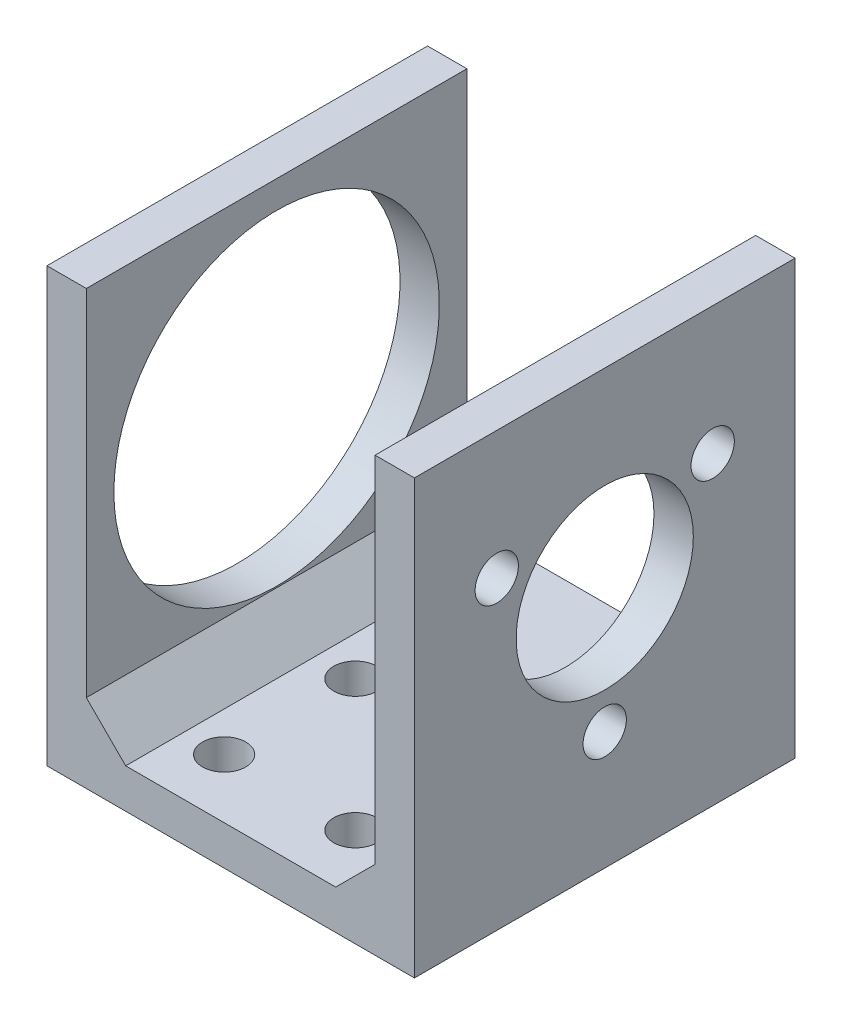
ISO-10303-21;
HEADER;
FILE_DESCRIPTION(('STEP AP214'),'2;1');
FILE_NAME('part.step','',(''),(''),'','','');
FILE_SCHEMA(('AUTOMOTIVE_DESIGN { 1 0 10303 214 1 1 1 1 }'));
ENDSEC;
DATA;
#1=APPLICATION_CONTEXT('core data for automotive mechanical design processes');
#2=APPLICATION_PROTOCOL_DEFINITION('international standard','automotive_design',2000,#1);
#3=PRODUCT_CONTEXT('',#1,'mechanical');
#4=PRODUCT('Part','Part','',(#3));
#5=PRODUCT_RELATED_PRODUCT_CATEGORY('part','',(#4));
#6=PRODUCT_DEFINITION_FORMATION('','',#4);
#7=PRODUCT_DEFINITION_CONTEXT('part definition',#1,'design');
#8=PRODUCT_DEFINITION('design','',#6,#7);
#9=PRODUCT_DEFINITION_SHAPE('','',#8);
#10=(LENGTH_UNIT() NAMED_UNIT(*) SI_UNIT(.MILLI.,.METRE.));
#11=(NAMED_UNIT(*) PLANE_ANGLE_UNIT() SI_UNIT($,.RADIAN.));
#12=(NAMED_UNIT(*) SI_UNIT($,.STERADIAN.) SOLID_ANGLE_UNIT());
#13=UNCERTAINTY_MEASURE_WITH_UNIT(LENGTH_MEASURE(1.E-05),#10,'distance_accuracy_value','');
#14=(GEOMETRIC_REPRESENTATION_CONTEXT(3) GLOBAL_UNCERTAINTY_ASSIGNED_CONTEXT((#13)) GLOBAL_UNIT_ASSIGNED_CONTEXT((#10,
#11,#12)) REPRESENTATION_CONTEXT('',''));
#15=CARTESIAN_POINT('',(0.,0.,0.));
#16=DIRECTION('',(0.,0.,1.));
#17=DIRECTION('',(1.,0.,0.));
#18=AXIS2_PLACEMENT_3D('',#15,#16,#17);
#19=CARTESIAN_POINT('',(0.,3.,0.));
#20=DIRECTION('',(0.,-1.,0.));
#21=DIRECTION('',(0.,0.,-1.));
#22=AXIS2_PLACEMENT_3D('',#19,#20,#21);
#23=PLANE('',#22);
#24=CARTESIAN_POINT('',(5.,3.,0.));
#25=DIRECTION('',(0.,1.,0.));
#26=DIRECTION('',(0.,0.,1.));
#27=AXIS2_PLACEMENT_3D('',#24,#25,#26);
#28=CIRCLE('',#27,1.65);
#29=CARTESIAN_POINT('',(5.,3.,1.65));
#30=VERTEX_POINT('',#29);
#31=EDGE_CURVE('E517',#30,#30,#28,.T.);
#32=ORIENTED_EDGE('',*,*,#31,.F.);
#33=EDGE_LOOP('',(#32));
#34=FACE_BOUND('',#33,.T.);
#35=CARTESIAN_POINT('',(-5.,3.,10.));
#36=DIRECTION('',(0.,1.,0.));
#37=DIRECTION('',(0.,0.,1.));
#38=AXIS2_PLACEMENT_3D('',#35,#36,#37);
#39=CIRCLE('',#38,1.65);
#40=CARTESIAN_POINT('',(-5.,3.,11.65));
#41=VERTEX_POINT('',#40);
#42=EDGE_CURVE('E521',#41,#41,#39,.T.);
#43=ORIENTED_EDGE('',*,*,#42,.F.);
#44=EDGE_LOOP('',(#43));
#45=FACE_BOUND('',#44,.T.);
#46=CARTESIAN_POINT('',(5.,3.,10.));
#47=DIRECTION('',(0.,1.,0.));
#48=DIRECTION('',(0.,0.,1.));
#49=AXIS2_PLACEMENT_3D('',#46,#47,#48);
#50=CIRCLE('',#49,1.65);
#51=CARTESIAN_POINT('',(5.,3.,11.65));
#52=VERTEX_POINT('',#51);
#53=EDGE_CURVE('E524',#52,#52,#50,.T.);
#54=ORIENTED_EDGE('',*,*,#53,.F.);
#55=EDGE_LOOP('',(#54));
#56=FACE_BOUND('',#55,.T.);
#57=CARTESIAN_POINT('',(5.,3.,-10.));
#58=DIRECTION('',(0.,1.,0.));
#59=DIRECTION('',(0.,0.,1.));
#60=AXIS2_PLACEMENT_3D('',#57,#58,#59);
#61=CIRCLE('',#60,1.65);
#62=CARTESIAN_POINT('',(5.,3.,-8.35));
#63=VERTEX_POINT('',#62);
#64=EDGE_CURVE('E527',#63,#63,#61,.T.);
#65=ORIENTED_EDGE('',*,*,#64,.F.);
#66=EDGE_LOOP('',(#65));
#67=FACE_BOUND('',#66,.T.);
#68=CARTESIAN_POINT('',(-5.,3.,0.));
#69=DIRECTION('',(0.,1.,0.));
#70=DIRECTION('',(0.,0.,1.));
#71=AXIS2_PLACEMENT_3D('',#68,#69,#70);
#72=CIRCLE('',#71,1.65);
#73=CARTESIAN_POINT('',(-5.,3.,1.65));
#74=VERTEX_POINT('',#73);
#75=EDGE_CURVE('E515',#74,#74,#72,.T.);
#76=ORIENTED_EDGE('',*,*,#75,.F.);
#77=EDGE_LOOP('',(#76));
#78=FACE_BOUND('',#77,.T.);
#79=CARTESIAN_POINT('',(-5.,3.,-10.));
#80=DIRECTION('',(0.,1.,0.));
#81=DIRECTION('',(0.,0.,1.));
#82=AXIS2_PLACEMENT_3D('',#79,#80,#81);
#83=CIRCLE('',#82,1.65);
#84=CARTESIAN_POINT('',(-5.,3.,-8.35));
#85=VERTEX_POINT('',#84);
#86=EDGE_CURVE('E185',#85,#85,#83,.T.);
#87=ORIENTED_EDGE('',*,*,#86,.F.);
#88=EDGE_LOOP('',(#87));
#89=FACE_BOUND('',#88,.T.);
#90=DIRECTION('',(1.,0.,0.));
#91=VECTOR('',#90,1.);
#92=CARTESIAN_POINT('',(-14.,3.,14.5));
#93=LINE('',#92,#91);
#94=CARTESIAN_POINT('',(-8.,3.,14.5));
#95=VERTEX_POINT('',#94);
#96=CARTESIAN_POINT('',(8.,3.,14.5));
#97=VERTEX_POINT('',#96);
#98=EDGE_CURVE('E57',#95,#97,#93,.T.);
#99=ORIENTED_EDGE('',*,*,#98,.T.);
#100=DIRECTION('',(0.,0.,-1.));
#101=VECTOR('',#100,1.);
#102=CARTESIAN_POINT('',(8.,3.,14.5));
#103=LINE('',#102,#101);
#104=CARTESIAN_POINT('',(8.,3.,-14.5));
#105=VERTEX_POINT('',#104);
#106=EDGE_CURVE('E52',#97,#105,#103,.T.);
#107=ORIENTED_EDGE('',*,*,#106,.T.);
#108=DIRECTION('',(-1.,0.,0.));
#109=VECTOR('',#108,1.);
#110=CARTESIAN_POINT('',(-14.,3.,-14.5));
#111=LINE('',#110,#109);
#112=CARTESIAN_POINT('',(-8.,3.,-14.5));
#113=VERTEX_POINT('',#112);
#114=EDGE_CURVE('E157',#105,#113,#111,.T.);
#115=ORIENTED_EDGE('',*,*,#114,.T.);
#116=DIRECTION('',(0.,0.,-1.));
#117=VECTOR('',#116,1.);
#118=CARTESIAN_POINT('',(-8.,3.,14.5));
#119=LINE('',#118,#117);
#120=EDGE_CURVE('E123',#95,#113,#119,.T.);
#121=ORIENTED_EDGE('',*,*,#120,.F.);
#122=EDGE_LOOP('',(#99,#107,#115,#121));
#123=FACE_BOUND('',#122,.T.);
#124=ADVANCED_FACE('F35',(#34,#45,#56,#67,#78,#89,#123),#23,.F.);
#125=CARTESIAN_POINT('',(14.,3.,14.5));
#126=DIRECTION('',(-1.,0.,0.));
#127=DIRECTION('',(0.,0.,1.));
#128=AXIS2_PLACEMENT_3D('',#125,#126,#127);
#129=PLANE('',#128);
#130=CARTESIAN_POINT('',(14.,18.5,0.));
#131=DIRECTION('',(1.,0.,0.));
#132=DIRECTION('',(0.,0.,-1.));
#133=AXIS2_PLACEMENT_3D('',#130,#131,#132);
#134=CIRCLE('',#133,6.75);
#135=CARTESIAN_POINT('',(14.,18.5,-6.75));
#136=VERTEX_POINT('',#135);
#137=EDGE_CURVE('E512',#136,#136,#134,.T.);
#138=ORIENTED_EDGE('',*,*,#137,.F.);
#139=EDGE_LOOP('',(#138));
#140=FACE_BOUND('',#139,.T.);
#141=CARTESIAN_POINT('',(14.,23.25,-8.22724133595217));
#142=DIRECTION('',(-1.,0.,0.));
#143=DIRECTION('',(0.,0.,1.));
#144=AXIS2_PLACEMENT_3D('',#141,#142,#143);
#145=CIRCLE('',#144,1.65);
#146=CARTESIAN_POINT('',(14.,23.25,-6.57724133595217));
#147=VERTEX_POINT('',#146);
#148=EDGE_CURVE('E233',#147,#147,#145,.T.);
#149=ORIENTED_EDGE('',*,*,#148,.T.);
#150=EDGE_LOOP('',(#149));
#151=FACE_BOUND('',#150,.T.);
#152=CARTESIAN_POINT('',(14.,23.25,8.22724133595216));
#153=DIRECTION('',(-1.,0.,0.));
#154=DIRECTION('',(0.,0.,1.));
#155=AXIS2_PLACEMENT_3D('',#152,#153,#154);
#156=CIRCLE('',#155,1.65);
#157=CARTESIAN_POINT('',(14.,23.25,9.87724133595216));
#158=VERTEX_POINT('',#157);
#159=EDGE_CURVE('E227',#158,#158,#156,.T.);
#160=ORIENTED_EDGE('',*,*,#159,.T.);
#161=EDGE_LOOP('',(#160));
#162=FACE_BOUND('',#161,.T.);
#163=CARTESIAN_POINT('',(14.,9.,0.));
#164=DIRECTION('',(-1.,0.,0.));
#165=DIRECTION('',(0.,0.,1.));
#166=AXIS2_PLACEMENT_3D('',#163,#164,#165);
#167=CIRCLE('',#166,1.65);
#168=CARTESIAN_POINT('',(14.,9.,1.65));
#169=VERTEX_POINT('',#168);
#170=EDGE_CURVE('E221',#169,#169,#167,.T.);
#171=ORIENTED_EDGE('',*,*,#170,.T.);
#172=EDGE_LOOP('',(#171));
#173=FACE_BOUND('',#172,.T.);
#174=DIRECTION('',(0.,0.,-1.));
#175=VECTOR('',#174,1.);
#176=CARTESIAN_POINT('',(14.,0.,14.5));
#177=LINE('',#176,#175);
#178=CARTESIAN_POINT('',(14.,0.,14.5));
#179=VERTEX_POINT('',#178);
#180=CARTESIAN_POINT('',(14.,0.,-14.5));
#181=VERTEX_POINT('',#180);
#182=EDGE_CURVE('E156',#179,#181,#177,.T.);
#183=ORIENTED_EDGE('',*,*,#182,.T.);
#184=DIRECTION('',(0.,-1.,0.));
#185=VECTOR('',#184,1.);
#186=CARTESIAN_POINT('',(14.,3.,-14.5));
#187=LINE('',#186,#185);
#188=CARTESIAN_POINT('',(14.,33.,-14.5));
#189=VERTEX_POINT('',#188);
#190=EDGE_CURVE('E11',#189,#181,#187,.T.);
#191=ORIENTED_EDGE('',*,*,#190,.F.);
#192=DIRECTION('',(0.,0.,-1.));
#193=VECTOR('',#192,1.);
#194=CARTESIAN_POINT('',(14.,33.,-14.5));
#195=LINE('',#194,#193);
#196=CARTESIAN_POINT('',(14.,33.,14.5));
#197=VERTEX_POINT('',#196);
#198=EDGE_CURVE('E135',#197,#189,#195,.T.);
#199=ORIENTED_EDGE('',*,*,#198,.F.);
#200=DIRECTION('',(0.,-1.,0.));
#201=VECTOR('',#200,1.);
#202=CARTESIAN_POINT('',(14.,3.,14.5));
#203=LINE('',#202,#201);
#204=EDGE_CURVE('E161',#197,#179,#203,.T.);
#205=ORIENTED_EDGE('',*,*,#204,.T.);
#206=EDGE_LOOP('',(#183,#191,#199,#205));
#207=FACE_BOUND('',#206,.T.);
#208=ADVANCED_FACE('F37',(#140,#151,#162,#173,#207),#129,.F.);
#209=CARTESIAN_POINT('',(-14.,3.,-14.5));
#210=DIRECTION('',(0.,0.,1.));
#211=DIRECTION('',(1.,0.,0.));
#212=AXIS2_PLACEMENT_3D('',#209,#210,#211);
#213=PLANE('',#212);
#214=ORIENTED_EDGE('',*,*,#114,.F.);
#215=DIRECTION('',(0.707106781186547,0.707106781186548,0.));
#216=VECTOR('',#215,1.);
#217=CARTESIAN_POINT('',(11.,6.,-14.5));
#218=LINE('',#217,#216);
#219=CARTESIAN_POINT('',(11.,6.,-14.5));
#220=VERTEX_POINT('',#219);
#221=EDGE_CURVE('E179',#105,#220,#218,.T.);
#222=ORIENTED_EDGE('',*,*,#221,.T.);
#223=DIRECTION('',(0.,-1.,0.));
#224=VECTOR('',#223,1.);
#225=CARTESIAN_POINT('',(11.,33.,-14.5));
#226=LINE('',#225,#224);
#227=CARTESIAN_POINT('',(11.,33.,-14.5));
#228=VERTEX_POINT('',#227);
#229=EDGE_CURVE('E154',#228,#220,#226,.T.);
#230=ORIENTED_EDGE('',*,*,#229,.F.);
#231=DIRECTION('',(-1.,0.,0.));
#232=VECTOR('',#231,1.);
#233=CARTESIAN_POINT('',(14.,33.,-14.5));
#234=LINE('',#233,#232);
#235=EDGE_CURVE('E139',#189,#228,#234,.T.);
#236=ORIENTED_EDGE('',*,*,#235,.F.);
#237=ORIENTED_EDGE('',*,*,#190,.T.);
#238=DIRECTION('',(-1.,0.,0.));
#239=VECTOR('',#238,1.);
#240=CARTESIAN_POINT('',(-14.,0.,-14.5));
#241=LINE('',#240,#239);
#242=CARTESIAN_POINT('',(-14.,0.,-14.5));
#243=VERTEX_POINT('',#242);
#244=EDGE_CURVE('E164',#181,#243,#241,.T.);
#245=ORIENTED_EDGE('',*,*,#244,.T.);
#246=DIRECTION('',(0.,-1.,0.));
#247=VECTOR('',#246,1.);
#248=CARTESIAN_POINT('',(-14.,3.,-14.5));
#249=LINE('',#248,#247);
#250=CARTESIAN_POINT('',(-14.,33.,-14.5));
#251=VERTEX_POINT('',#250);
#252=EDGE_CURVE('E44',#251,#243,#249,.T.);
#253=ORIENTED_EDGE('',*,*,#252,.F.);
#254=DIRECTION('',(-1.,0.,0.));
#255=VECTOR('',#254,1.);
#256=CARTESIAN_POINT('',(-14.,33.,-14.5));
#257=LINE('',#256,#255);
#258=CARTESIAN_POINT('',(-11.,33.,-14.5));
#259=VERTEX_POINT('',#258);
#260=EDGE_CURVE('E141',#259,#251,#257,.T.);
#261=ORIENTED_EDGE('',*,*,#260,.F.);
#262=DIRECTION('',(0.,-1.,0.));
#263=VECTOR('',#262,1.);
#264=CARTESIAN_POINT('',(-11.,33.,-14.5));
#265=LINE('',#264,#263);
#266=CARTESIAN_POINT('',(-11.,6.,-14.5));
#267=VERTEX_POINT('',#266);
#268=EDGE_CURVE('E136',#259,#267,#265,.T.);
#269=ORIENTED_EDGE('',*,*,#268,.T.);
#270=DIRECTION('',(0.707106781186548,-0.707106781186547,0.));
#271=VECTOR('',#270,1.);
#272=CARTESIAN_POINT('',(-11.,6.,-14.5));
#273=LINE('',#272,#271);
#274=EDGE_CURVE('E118',#267,#113,#273,.T.);
#275=ORIENTED_EDGE('',*,*,#274,.T.);
#276=EDGE_LOOP('',(#214,#222,#230,#236,#237,#245,#253,#261,#269,#275));
#277=FACE_BOUND('',#276,.T.);
#278=ADVANCED_FACE('F268',(#277),#213,.F.);
#279=CARTESIAN_POINT('',(-14.,3.,14.5));
#280=DIRECTION('',(1.,0.,0.));
#281=DIRECTION('',(0.,0.,-1.));
#282=AXIS2_PLACEMENT_3D('',#279,#280,#281);
#283=PLANE('',#282);
#284=CARTESIAN_POINT('',(-14.,18.5,0.));
#285=DIRECTION('',(-1.,0.,0.));
#286=DIRECTION('',(0.,0.,1.));
#287=AXIS2_PLACEMENT_3D('',#284,#285,#286);
#288=CIRCLE('',#287,12.4);
#289=CARTESIAN_POINT('',(-14.,18.5,12.4));
#290=VERTEX_POINT('',#289);
#291=EDGE_CURVE('E180',#290,#290,#288,.T.);
#292=ORIENTED_EDGE('',*,*,#291,.F.);
#293=EDGE_LOOP('',(#292));
#294=FACE_BOUND('',#293,.T.);
#295=DIRECTION('',(0.,0.,1.));
#296=VECTOR('',#295,1.);
#297=CARTESIAN_POINT('',(-14.,0.,14.5));
#298=LINE('',#297,#296);
#299=CARTESIAN_POINT('',(-14.,0.,14.5));
#300=VERTEX_POINT('',#299);
#301=EDGE_CURVE('E166',#243,#300,#298,.T.);
#302=ORIENTED_EDGE('',*,*,#301,.T.);
#303=DIRECTION('',(0.,-1.,0.));
#304=VECTOR('',#303,1.);
#305=CARTESIAN_POINT('',(-14.,3.,14.5));
#306=LINE('',#305,#304);
#307=CARTESIAN_POINT('',(-14.,33.,14.5));
#308=VERTEX_POINT('',#307);
#309=EDGE_CURVE('E171',#308,#300,#306,.T.);
#310=ORIENTED_EDGE('',*,*,#309,.F.);
#311=DIRECTION('',(0.,0.,1.));
#312=VECTOR('',#311,1.);
#313=CARTESIAN_POINT('',(-14.,33.,-14.5));
#314=LINE('',#313,#312);
#315=EDGE_CURVE('E236',#251,#308,#314,.T.);
#316=ORIENTED_EDGE('',*,*,#315,.F.);
#317=ORIENTED_EDGE('',*,*,#252,.T.);
#318=EDGE_LOOP('',(#302,#310,#316,#317));
#319=FACE_BOUND('',#318,.T.);
#320=ADVANCED_FACE('F248',(#294,#319),#283,.F.);
#321=CARTESIAN_POINT('',(-14.,3.,14.5));
#322=DIRECTION('',(0.,0.,-1.));
#323=DIRECTION('',(-1.,0.,0.));
#324=AXIS2_PLACEMENT_3D('',#321,#322,#323);
#325=PLANE('',#324);
#326=DIRECTION('',(0.707106781186547,0.707106781186548,0.));
#327=VECTOR('',#326,1.);
#328=CARTESIAN_POINT('',(11.,6.,14.5));
#329=LINE('',#328,#327);
#330=CARTESIAN_POINT('',(11.,6.,14.5));
#331=VERTEX_POINT('',#330);
#332=EDGE_CURVE('E207',#97,#331,#329,.T.);
#333=ORIENTED_EDGE('',*,*,#332,.F.);
#334=ORIENTED_EDGE('',*,*,#98,.F.);
#335=DIRECTION('',(0.707106781186548,-0.707106781186547,0.));
#336=VECTOR('',#335,1.);
#337=CARTESIAN_POINT('',(-11.,6.,14.5));
#338=LINE('',#337,#336);
#339=CARTESIAN_POINT('',(-11.,6.,14.5));
#340=VERTEX_POINT('',#339);
#341=EDGE_CURVE('E116',#340,#95,#338,.T.);
#342=ORIENTED_EDGE('',*,*,#341,.F.);
#343=DIRECTION('',(0.,-1.,0.));
#344=VECTOR('',#343,1.);
#345=CARTESIAN_POINT('',(-11.,33.,14.5));
#346=LINE('',#345,#344);
#347=CARTESIAN_POINT('',(-11.,33.,14.5));
#348=VERTEX_POINT('',#347);
#349=EDGE_CURVE('E130',#348,#340,#346,.T.);
#350=ORIENTED_EDGE('',*,*,#349,.F.);
#351=DIRECTION('',(1.,0.,0.));
#352=VECTOR('',#351,1.);
#353=CARTESIAN_POINT('',(-14.,33.,14.5));
#354=LINE('',#353,#352);
#355=EDGE_CURVE('E239',#308,#348,#354,.T.);
#356=ORIENTED_EDGE('',*,*,#355,.F.);
#357=ORIENTED_EDGE('',*,*,#309,.T.);
#358=DIRECTION('',(1.,0.,0.));
#359=VECTOR('',#358,1.);
#360=CARTESIAN_POINT('',(-14.,0.,14.5));
#361=LINE('',#360,#359);
#362=EDGE_CURVE('E159',#300,#179,#361,.T.);
#363=ORIENTED_EDGE('',*,*,#362,.T.);
#364=ORIENTED_EDGE('',*,*,#204,.F.);
#365=DIRECTION('',(1.,0.,0.));
#366=VECTOR('',#365,1.);
#367=CARTESIAN_POINT('',(14.,33.,14.5));
#368=LINE('',#367,#366);
#369=CARTESIAN_POINT('',(11.,33.,14.5));
#370=VERTEX_POINT('',#369);
#371=EDGE_CURVE('E148',#370,#197,#368,.T.);
#372=ORIENTED_EDGE('',*,*,#371,.F.);
#373=DIRECTION('',(0.,-1.,0.));
#374=VECTOR('',#373,1.);
#375=CARTESIAN_POINT('',(11.,33.,14.5));
#376=LINE('',#375,#374);
#377=EDGE_CURVE('E151',#370,#331,#376,.T.);
#378=ORIENTED_EDGE('',*,*,#377,.T.);
#379=EDGE_LOOP('',(#333,#334,#342,#350,#356,#357,#363,#364,#372,#378));
#380=FACE_BOUND('',#379,.T.);
#381=ADVANCED_FACE('F128',(#380),#325,.F.);
#382=CARTESIAN_POINT('',(0.,0.,0.));
#383=DIRECTION('',(0.,-1.,0.));
#384=DIRECTION('',(0.,0.,-1.));
#385=AXIS2_PLACEMENT_3D('',#382,#383,#384);
#386=PLANE('',#385);
#387=CARTESIAN_POINT('',(5.,0.,0.));
#388=DIRECTION('',(0.,-1.,0.));
#389=DIRECTION('',(0.,0.,-1.));
#390=AXIS2_PLACEMENT_3D('',#387,#388,#389);
#391=CIRCLE('',#390,1.65);
#392=CARTESIAN_POINT('',(5.,0.,-1.65));
#393=VERTEX_POINT('',#392);
#394=EDGE_CURVE('E196',#393,#393,#391,.T.);
#395=ORIENTED_EDGE('',*,*,#394,.F.);
#396=EDGE_LOOP('',(#395));
#397=FACE_BOUND('',#396,.T.);
#398=CARTESIAN_POINT('',(-5.,0.,10.));
#399=DIRECTION('',(0.,-1.,0.));
#400=DIRECTION('',(0.,0.,-1.));
#401=AXIS2_PLACEMENT_3D('',#398,#399,#400);
#402=CIRCLE('',#401,1.65);
#403=CARTESIAN_POINT('',(-5.,0.,8.35));
#404=VERTEX_POINT('',#403);
#405=EDGE_CURVE('E194',#404,#404,#402,.T.);
#406=ORIENTED_EDGE('',*,*,#405,.F.);
#407=EDGE_LOOP('',(#406));
#408=FACE_BOUND('',#407,.T.);
#409=CARTESIAN_POINT('',(5.,0.,10.));
#410=DIRECTION('',(0.,-1.,0.));
#411=DIRECTION('',(0.,0.,-1.));
#412=AXIS2_PLACEMENT_3D('',#409,#410,#411);
#413=CIRCLE('',#412,1.65);
#414=CARTESIAN_POINT('',(5.,0.,8.35));
#415=VERTEX_POINT('',#414);
#416=EDGE_CURVE('E191',#415,#415,#413,.T.);
#417=ORIENTED_EDGE('',*,*,#416,.F.);
#418=EDGE_LOOP('',(#417));
#419=FACE_BOUND('',#418,.T.);
#420=CARTESIAN_POINT('',(5.,0.,-10.));
#421=DIRECTION('',(0.,-1.,0.));
#422=DIRECTION('',(0.,0.,-1.));
#423=AXIS2_PLACEMENT_3D('',#420,#421,#422);
#424=CIRCLE('',#423,1.65);
#425=CARTESIAN_POINT('',(5.,0.,-11.65));
#426=VERTEX_POINT('',#425);
#427=EDGE_CURVE('E188',#426,#426,#424,.T.);
#428=ORIENTED_EDGE('',*,*,#427,.F.);
#429=EDGE_LOOP('',(#428));
#430=FACE_BOUND('',#429,.T.);
#431=CARTESIAN_POINT('',(-5.,0.,0.));
#432=DIRECTION('',(0.,-1.,0.));
#433=DIRECTION('',(0.,0.,-1.));
#434=AXIS2_PLACEMENT_3D('',#431,#432,#433);
#435=CIRCLE('',#434,1.65);
#436=CARTESIAN_POINT('',(-5.,0.,-1.65));
#437=VERTEX_POINT('',#436);
#438=EDGE_CURVE('E184',#437,#437,#435,.T.);
#439=ORIENTED_EDGE('',*,*,#438,.F.);
#440=EDGE_LOOP('',(#439));
#441=FACE_BOUND('',#440,.T.);
#442=CARTESIAN_POINT('',(-5.,0.,-10.));
#443=DIRECTION('',(0.,-1.,0.));
#444=DIRECTION('',(0.,0.,-1.));
#445=AXIS2_PLACEMENT_3D('',#442,#443,#444);
#446=CIRCLE('',#445,1.65);
#447=CARTESIAN_POINT('',(-5.,0.,-11.65));
#448=VERTEX_POINT('',#447);
#449=EDGE_CURVE('E181',#448,#448,#446,.T.);
#450=ORIENTED_EDGE('',*,*,#449,.F.);
#451=EDGE_LOOP('',(#450));
#452=FACE_BOUND('',#451,.T.);
#453=ORIENTED_EDGE('',*,*,#182,.F.);
#454=ORIENTED_EDGE('',*,*,#362,.F.);
#455=ORIENTED_EDGE('',*,*,#301,.F.);
#456=ORIENTED_EDGE('',*,*,#244,.F.);
#457=EDGE_LOOP('',(#453,#454,#455,#456));
#458=FACE_BOUND('',#457,.T.);
#459=ADVANCED_FACE('F253',(#397,#408,#419,#430,#441,#452,#458),#386,.T.);
#460=CARTESIAN_POINT('',(11.,33.,-14.5));
#461=DIRECTION('',(1.,0.,0.));
#462=DIRECTION('',(0.,0.,-1.));
#463=AXIS2_PLACEMENT_3D('',#460,#461,#462);
#464=PLANE('',#463);
#465=CARTESIAN_POINT('',(11.,18.5,0.));
#466=DIRECTION('',(1.,0.,0.));
#467=DIRECTION('',(0.,0.,-1.));
#468=AXIS2_PLACEMENT_3D('',#465,#466,#467);
#469=CIRCLE('',#468,6.75);
#470=CARTESIAN_POINT('',(11.,18.5,-6.75));
#471=VERTEX_POINT('',#470);
#472=EDGE_CURVE('E39',#471,#471,#469,.T.);
#473=ORIENTED_EDGE('',*,*,#472,.T.);
#474=EDGE_LOOP('',(#473));
#475=FACE_BOUND('',#474,.T.);
#476=CARTESIAN_POINT('',(11.,23.25,-8.22724133595217));
#477=DIRECTION('',(1.,0.,0.));
#478=DIRECTION('',(0.,0.,-1.));
#479=AXIS2_PLACEMENT_3D('',#476,#477,#478);
#480=CIRCLE('',#479,1.65);
#481=CARTESIAN_POINT('',(11.,23.25,-9.87724133595217));
#482=VERTEX_POINT('',#481);
#483=EDGE_CURVE('E230',#482,#482,#480,.T.);
#484=ORIENTED_EDGE('',*,*,#483,.T.);
#485=EDGE_LOOP('',(#484));
#486=FACE_BOUND('',#485,.T.);
#487=CARTESIAN_POINT('',(11.,23.25,8.22724133595216));
#488=DIRECTION('',(1.,0.,0.));
#489=DIRECTION('',(0.,0.,-1.));
#490=AXIS2_PLACEMENT_3D('',#487,#488,#489);
#491=CIRCLE('',#490,1.65);
#492=CARTESIAN_POINT('',(11.,23.25,6.57724133595216));
#493=VERTEX_POINT('',#492);
#494=EDGE_CURVE('E224',#493,#493,#491,.T.);
#495=ORIENTED_EDGE('',*,*,#494,.T.);
#496=EDGE_LOOP('',(#495));
#497=FACE_BOUND('',#496,.T.);
#498=CARTESIAN_POINT('',(11.,9.,0.));
#499=DIRECTION('',(1.,0.,0.));
#500=DIRECTION('',(0.,0.,-1.));
#501=AXIS2_PLACEMENT_3D('',#498,#499,#500);
#502=CIRCLE('',#501,1.65);
#503=CARTESIAN_POINT('',(11.,9.,-1.65));
#504=VERTEX_POINT('',#503);
#505=EDGE_CURVE('E217',#504,#504,#502,.T.);
#506=ORIENTED_EDGE('',*,*,#505,.T.);
#507=EDGE_LOOP('',(#506));
#508=FACE_BOUND('',#507,.T.);
#509=ORIENTED_EDGE('',*,*,#229,.T.);
#510=DIRECTION('',(0.,0.,-1.));
#511=VECTOR('',#510,1.);
#512=CARTESIAN_POINT('',(11.,6.,14.5));
#513=LINE('',#512,#511);
#514=EDGE_CURVE('E212',#331,#220,#513,.T.);
#515=ORIENTED_EDGE('',*,*,#514,.F.);
#516=ORIENTED_EDGE('',*,*,#377,.F.);
#517=DIRECTION('',(0.,0.,1.));
#518=VECTOR('',#517,1.);
#519=CARTESIAN_POINT('',(11.,33.,-14.5));
#520=LINE('',#519,#518);
#521=EDGE_CURVE('E146',#228,#370,#520,.T.);
#522=ORIENTED_EDGE('',*,*,#521,.F.);
#523=EDGE_LOOP('',(#509,#515,#516,#522));
#524=FACE_BOUND('',#523,.T.);
#525=ADVANCED_FACE('F264',(#475,#486,#497,#508,#524),#464,.F.);
#526=CARTESIAN_POINT('',(0.,33.,0.));
#527=DIRECTION('',(0.,-1.,0.));
#528=DIRECTION('',(0.,0.,-1.));
#529=AXIS2_PLACEMENT_3D('',#526,#527,#528);
#530=PLANE('',#529);
#531=ORIENTED_EDGE('',*,*,#198,.T.);
#532=ORIENTED_EDGE('',*,*,#235,.T.);
#533=ORIENTED_EDGE('',*,*,#521,.T.);
#534=ORIENTED_EDGE('',*,*,#371,.T.);
#535=EDGE_LOOP('',(#531,#532,#533,#534));
#536=FACE_BOUND('',#535,.T.);
#537=ADVANCED_FACE('F259',(#536),#530,.F.);
#538=CARTESIAN_POINT('',(-11.,33.,-14.5));
#539=DIRECTION('',(-1.,0.,0.));
#540=DIRECTION('',(0.,0.,1.));
#541=AXIS2_PLACEMENT_3D('',#538,#539,#540);
#542=PLANE('',#541);
#543=CARTESIAN_POINT('',(-11.,18.5,0.));
#544=DIRECTION('',(-1.,0.,0.));
#545=DIRECTION('',(0.,0.,1.));
#546=AXIS2_PLACEMENT_3D('',#543,#544,#545);
#547=CIRCLE('',#546,12.4);
#548=CARTESIAN_POINT('',(-11.,18.5,12.4));
#549=VERTEX_POINT('',#548);
#550=EDGE_CURVE('E176',#549,#549,#547,.T.);
#551=ORIENTED_EDGE('',*,*,#550,.T.);
#552=EDGE_LOOP('',(#551));
#553=FACE_BOUND('',#552,.T.);
#554=ORIENTED_EDGE('',*,*,#349,.T.);
#555=DIRECTION('',(0.,0.,-1.));
#556=VECTOR('',#555,1.);
#557=CARTESIAN_POINT('',(-11.,6.,14.5));
#558=LINE('',#557,#556);
#559=EDGE_CURVE('E112',#340,#267,#558,.T.);
#560=ORIENTED_EDGE('',*,*,#559,.T.);
#561=ORIENTED_EDGE('',*,*,#268,.F.);
#562=DIRECTION('',(0.,0.,-1.));
#563=VECTOR('',#562,1.);
#564=CARTESIAN_POINT('',(-11.,33.,-14.5));
#565=LINE('',#564,#563);
#566=EDGE_CURVE('E134',#348,#259,#565,.T.);
#567=ORIENTED_EDGE('',*,*,#566,.F.);
#568=EDGE_LOOP('',(#554,#560,#561,#567));
#569=FACE_BOUND('',#568,.T.);
#570=ADVANCED_FACE('F133',(#553,#569),#542,.F.);
#571=CARTESIAN_POINT('',(0.,33.,0.));
#572=DIRECTION('',(0.,1.,0.));
#573=DIRECTION('',(0.,0.,1.));
#574=AXIS2_PLACEMENT_3D('',#571,#572,#573);
#575=PLANE('',#574);
#576=ORIENTED_EDGE('',*,*,#315,.T.);
#577=ORIENTED_EDGE('',*,*,#355,.T.);
#578=ORIENTED_EDGE('',*,*,#566,.T.);
#579=ORIENTED_EDGE('',*,*,#260,.T.);
#580=EDGE_LOOP('',(#576,#577,#578,#579));
#581=FACE_BOUND('',#580,.T.);
#582=ADVANCED_FACE('F245',(#581),#575,.T.);
#583=CARTESIAN_POINT('',(19.,9.,0.));
#584=DIRECTION('',(-1.,0.,0.));
#585=DIRECTION('',(0.,0.,1.));
#586=AXIS2_PLACEMENT_3D('',#583,#584,#585);
#587=CYLINDRICAL_SURFACE('',#586,1.65);
#588=ORIENTED_EDGE('',*,*,#505,.F.);
#589=EDGE_LOOP('',(#588));
#590=FACE_BOUND('',#589,.T.);
#591=ORIENTED_EDGE('',*,*,#170,.F.);
#592=EDGE_LOOP('',(#591));
#593=FACE_BOUND('',#592,.T.);
#594=ADVANCED_FACE('F335',(#590,#593),#587,.F.);
#595=CARTESIAN_POINT('',(19.,23.25,8.22724133595216));
#596=DIRECTION('',(-1.,0.,0.));
#597=DIRECTION('',(0.,0.,1.));
#598=AXIS2_PLACEMENT_3D('',#595,#596,#597);
#599=CYLINDRICAL_SURFACE('',#598,1.65);
#600=ORIENTED_EDGE('',*,*,#494,.F.);
#601=EDGE_LOOP('',(#600));
#602=FACE_BOUND('',#601,.T.);
#603=ORIENTED_EDGE('',*,*,#159,.F.);
#604=EDGE_LOOP('',(#603));
#605=FACE_BOUND('',#604,.T.);
#606=ADVANCED_FACE('F342',(#602,#605),#599,.F.);
#607=CARTESIAN_POINT('',(19.,23.25,-8.22724133595217));
#608=DIRECTION('',(-1.,0.,0.));
#609=DIRECTION('',(0.,0.,1.));
#610=AXIS2_PLACEMENT_3D('',#607,#608,#609);
#611=CYLINDRICAL_SURFACE('',#610,1.65);
#612=ORIENTED_EDGE('',*,*,#483,.F.);
#613=EDGE_LOOP('',(#612));
#614=FACE_BOUND('',#613,.T.);
#615=ORIENTED_EDGE('',*,*,#148,.F.);
#616=EDGE_LOOP('',(#615));
#617=FACE_BOUND('',#616,.T.);
#618=ADVANCED_FACE('F350',(#614,#617),#611,.F.);
#619=CARTESIAN_POINT('',(-11.,6.,14.5));
#620=DIRECTION('',(0.707106781186547,0.707106781186548,0.));
#621=DIRECTION('',(-0.707106781186548,0.707106781186547,0.));
#622=AXIS2_PLACEMENT_3D('',#619,#620,#621);
#623=PLANE('',#622);
#624=ORIENTED_EDGE('',*,*,#274,.F.);
#625=ORIENTED_EDGE('',*,*,#559,.F.);
#626=ORIENTED_EDGE('',*,*,#341,.T.);
#627=ORIENTED_EDGE('',*,*,#120,.T.);
#628=EDGE_LOOP('',(#624,#625,#626,#627));
#629=FACE_BOUND('',#628,.T.);
#630=ADVANCED_FACE('F114',(#629),#623,.T.);
#631=CARTESIAN_POINT('',(11.,6.,14.5));
#632=DIRECTION('',(-0.707106781186548,0.707106781186547,0.));
#633=DIRECTION('',(-0.707106781186547,-0.707106781186548,0.));
#634=AXIS2_PLACEMENT_3D('',#631,#632,#633);
#635=PLANE('',#634);
#636=ORIENTED_EDGE('',*,*,#221,.F.);
#637=ORIENTED_EDGE('',*,*,#106,.F.);
#638=ORIENTED_EDGE('',*,*,#332,.T.);
#639=ORIENTED_EDGE('',*,*,#514,.T.);
#640=EDGE_LOOP('',(#636,#637,#638,#639));
#641=FACE_BOUND('',#640,.T.);
#642=ADVANCED_FACE('F267',(#641),#635,.T.);
#643=CARTESIAN_POINT('',(-9.,18.5,0.));
#644=DIRECTION('',(-1.,0.,0.));
#645=DIRECTION('',(0.,0.,1.));
#646=AXIS2_PLACEMENT_3D('',#643,#644,#645);
#647=CYLINDRICAL_SURFACE('',#646,12.4);
#648=ORIENTED_EDGE('',*,*,#291,.T.);
#649=EDGE_LOOP('',(#648));
#650=FACE_BOUND('',#649,.T.);
#651=ORIENTED_EDGE('',*,*,#550,.F.);
#652=EDGE_LOOP('',(#651));
#653=FACE_BOUND('',#652,.T.);
#654=ADVANCED_FACE('F368',(#650,#653),#647,.F.);
#655=CARTESIAN_POINT('',(-5.,-2.,-10.));
#656=DIRECTION('',(0.,1.,0.));
#657=DIRECTION('',(0.,0.,1.));
#658=AXIS2_PLACEMENT_3D('',#655,#656,#657);
#659=CYLINDRICAL_SURFACE('',#658,1.65);
#660=ORIENTED_EDGE('',*,*,#449,.T.);
#661=EDGE_LOOP('',(#660));
#662=FACE_BOUND('',#661,.T.);
#663=ORIENTED_EDGE('',*,*,#86,.T.);
#664=EDGE_LOOP('',(#663));
#665=FACE_BOUND('',#664,.T.);
#666=ADVANCED_FACE('F374',(#662,#665),#659,.F.);
#667=CARTESIAN_POINT('',(-5.,-2.,0.));
#668=DIRECTION('',(0.,1.,0.));
#669=DIRECTION('',(0.,0.,1.));
#670=AXIS2_PLACEMENT_3D('',#667,#668,#669);
#671=CYLINDRICAL_SURFACE('',#670,1.65);
#672=ORIENTED_EDGE('',*,*,#438,.T.);
#673=EDGE_LOOP('',(#672));
#674=FACE_BOUND('',#673,.T.);
#675=ORIENTED_EDGE('',*,*,#75,.T.);
#676=EDGE_LOOP('',(#675));
#677=FACE_BOUND('',#676,.T.);
#678=ADVANCED_FACE('F380',(#674,#677),#671,.F.);
#679=CARTESIAN_POINT('',(5.,-2.,-10.));
#680=DIRECTION('',(0.,1.,0.));
#681=DIRECTION('',(0.,0.,1.));
#682=AXIS2_PLACEMENT_3D('',#679,#680,#681);
#683=CYLINDRICAL_SURFACE('',#682,1.65);
#684=ORIENTED_EDGE('',*,*,#427,.T.);
#685=EDGE_LOOP('',(#684));
#686=FACE_BOUND('',#685,.T.);
#687=ORIENTED_EDGE('',*,*,#64,.T.);
#688=EDGE_LOOP('',(#687));
#689=FACE_BOUND('',#688,.T.);
#690=ADVANCED_FACE('F388',(#686,#689),#683,.F.);
#691=CARTESIAN_POINT('',(5.,-2.,10.));
#692=DIRECTION('',(0.,1.,0.));
#693=DIRECTION('',(0.,0.,1.));
#694=AXIS2_PLACEMENT_3D('',#691,#692,#693);
#695=CYLINDRICAL_SURFACE('',#694,1.65);
#696=ORIENTED_EDGE('',*,*,#416,.T.);
#697=EDGE_LOOP('',(#696));
#698=FACE_BOUND('',#697,.T.);
#699=ORIENTED_EDGE('',*,*,#53,.T.);
#700=EDGE_LOOP('',(#699));
#701=FACE_BOUND('',#700,.T.);
#702=ADVANCED_FACE('F396',(#698,#701),#695,.F.);
#703=CARTESIAN_POINT('',(-5.,-2.,10.));
#704=DIRECTION('',(0.,1.,0.));
#705=DIRECTION('',(0.,0.,1.));
#706=AXIS2_PLACEMENT_3D('',#703,#704,#705);
#707=CYLINDRICAL_SURFACE('',#706,1.65);
#708=ORIENTED_EDGE('',*,*,#405,.T.);
#709=EDGE_LOOP('',(#708));
#710=FACE_BOUND('',#709,.T.);
#711=ORIENTED_EDGE('',*,*,#42,.T.);
#712=EDGE_LOOP('',(#711));
#713=FACE_BOUND('',#712,.T.);
#714=ADVANCED_FACE('F404',(#710,#713),#707,.F.);
#715=CARTESIAN_POINT('',(5.,-2.,0.));
#716=DIRECTION('',(0.,1.,0.));
#717=DIRECTION('',(0.,0.,1.));
#718=AXIS2_PLACEMENT_3D('',#715,#716,#717);
#719=CYLINDRICAL_SURFACE('',#718,1.65);
#720=ORIENTED_EDGE('',*,*,#394,.T.);
#721=EDGE_LOOP('',(#720));
#722=FACE_BOUND('',#721,.T.);
#723=ORIENTED_EDGE('',*,*,#31,.T.);
#724=EDGE_LOOP('',(#723));
#725=FACE_BOUND('',#724,.T.);
#726=ADVANCED_FACE('F412',(#722,#725),#719,.F.);
#727=CARTESIAN_POINT('',(9.00000000000001,18.5,0.));
#728=DIRECTION('',(1.,0.,0.));
#729=DIRECTION('',(0.,0.,-1.));
#730=AXIS2_PLACEMENT_3D('',#727,#728,#729);
#731=CYLINDRICAL_SURFACE('',#730,6.75);
#732=ORIENTED_EDGE('',*,*,#137,.T.);
#733=EDGE_LOOP('',(#732));
#734=FACE_BOUND('',#733,.T.);
#735=ORIENTED_EDGE('',*,*,#472,.F.);
#736=EDGE_LOOP('',(#735));
#737=FACE_BOUND('',#736,.T.);
#738=ADVANCED_FACE('F420',(#734,#737),#731,.F.);
#739=CLOSED_SHELL('',(#124,#208,#278,#320,#381,#459,#525,#537,#570,#582,#594,#606,#618,#630,
#642,#654,#666,#678,#690,#702,#714,#726,#738));
#740=MANIFOLD_SOLID_BREP('B2',#739);
#741=ADVANCED_BREP_SHAPE_REPRESENTATION('',(#18,#740),#14);
#742=SHAPE_DEFINITION_REPRESENTATION(#9,#741);
ENDSEC;
END-ISO-10303-21;
